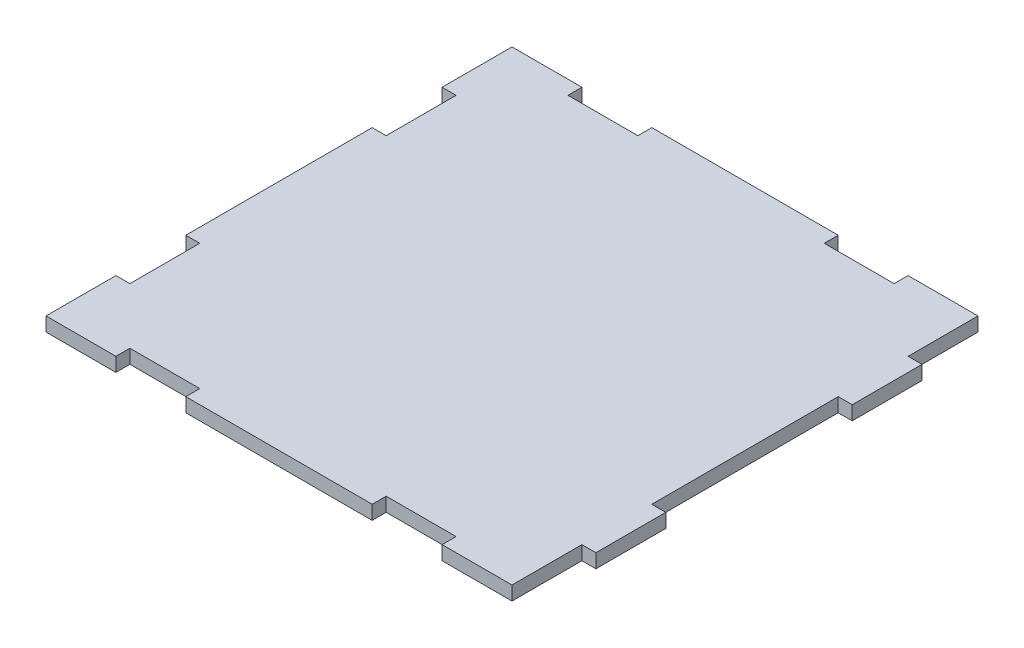
ISO-10303-21;
HEADER;
FILE_DESCRIPTION(('STEP AP214'),'2;1');
FILE_NAME('part.step','',(''),(''),'','','');
FILE_SCHEMA(('AUTOMOTIVE_DESIGN { 1 0 10303 214 1 1 1 1 }'));
ENDSEC;
DATA;
#1=APPLICATION_CONTEXT('core data for automotive mechanical design processes');
#2=APPLICATION_PROTOCOL_DEFINITION('international standard','automotive_design',2000,#1);
#3=PRODUCT_CONTEXT('',#1,'mechanical');
#4=PRODUCT('Part','Part','',(#3));
#5=PRODUCT_RELATED_PRODUCT_CATEGORY('part','',(#4));
#6=PRODUCT_DEFINITION_FORMATION('','',#4);
#7=PRODUCT_DEFINITION_CONTEXT('part definition',#1,'design');
#8=PRODUCT_DEFINITION('design','',#6,#7);
#9=PRODUCT_DEFINITION_SHAPE('','',#8);
#10=(LENGTH_UNIT() NAMED_UNIT(*) SI_UNIT(.MILLI.,.METRE.));
#11=(NAMED_UNIT(*) PLANE_ANGLE_UNIT() SI_UNIT($,.RADIAN.));
#12=(NAMED_UNIT(*) SI_UNIT($,.STERADIAN.) SOLID_ANGLE_UNIT());
#13=UNCERTAINTY_MEASURE_WITH_UNIT(LENGTH_MEASURE(1.E-05),#10,'distance_accuracy_value','');
#14=(GEOMETRIC_REPRESENTATION_CONTEXT(3) GLOBAL_UNCERTAINTY_ASSIGNED_CONTEXT((#13)) GLOBAL_UNIT_ASSIGNED_CONTEXT((#10,
#11,#12)) REPRESENTATION_CONTEXT('',''));
#15=CARTESIAN_POINT('',(0.,0.,0.));
#16=DIRECTION('',(0.,0.,1.));
#17=DIRECTION('',(1.,0.,0.));
#18=AXIS2_PLACEMENT_3D('',#15,#16,#17);
#19=CARTESIAN_POINT('',(-100.,6.,-100.));
#20=DIRECTION('',(0.,0.,1.));
#21=DIRECTION('',(1.,0.,0.));
#22=AXIS2_PLACEMENT_3D('',#19,#20,#21);
#23=PLANE('',#22);
#24=DIRECTION('',(-1.,0.,0.));
#25=VECTOR('',#24,1.);
#26=CARTESIAN_POINT('',(-100.,6.,-100.));
#27=LINE('',#26,#25);
#28=CARTESIAN_POINT('',(40.,6.,-100.));
#29=VERTEX_POINT('',#28);
#30=CARTESIAN_POINT('',(-40.,6.,-100.));
#31=VERTEX_POINT('',#30);
#32=EDGE_CURVE('E614',#29,#31,#27,.T.);
#33=ORIENTED_EDGE('',*,*,#32,.F.);
#34=DIRECTION('',(0.,1.,0.));
#35=VECTOR('',#34,1.);
#36=CARTESIAN_POINT('',(40.,-4.,-100.));
#37=LINE('',#36,#35);
#38=CARTESIAN_POINT('',(40.,0.,-100.));
#39=VERTEX_POINT('',#38);
#40=EDGE_CURVE('E473',#39,#29,#37,.T.);
#41=ORIENTED_EDGE('',*,*,#40,.F.);
#42=DIRECTION('',(-1.,0.,0.));
#43=VECTOR('',#42,1.);
#44=CARTESIAN_POINT('',(-100.,0.,-100.));
#45=LINE('',#44,#43);
#46=CARTESIAN_POINT('',(-40.,0.,-100.));
#47=VERTEX_POINT('',#46);
#48=EDGE_CURVE('E339',#39,#47,#45,.T.);
#49=ORIENTED_EDGE('',*,*,#48,.T.);
#50=DIRECTION('',(0.,1.,0.));
#51=VECTOR('',#50,1.);
#52=CARTESIAN_POINT('',(-40.,-4.,-100.));
#53=LINE('',#52,#51);
#54=EDGE_CURVE('E498',#47,#31,#53,.T.);
#55=ORIENTED_EDGE('',*,*,#54,.T.);
#56=EDGE_LOOP('',(#33,#41,#49,#55));
#57=FACE_BOUND('',#56,.T.);
#58=ADVANCED_FACE('F43',(#57),#23,.F.);
#59=CARTESIAN_POINT('',(-70.,6.,-100.));
#60=VERTEX_POINT('',#59);
#61=CARTESIAN_POINT('',(-100.,6.,-100.));
#62=VERTEX_POINT('',#61);
#63=EDGE_CURVE('E367',#60,#62,#27,.T.);
#64=ORIENTED_EDGE('',*,*,#63,.F.);
#65=DIRECTION('',(0.,1.,0.));
#66=VECTOR('',#65,1.);
#67=CARTESIAN_POINT('',(-70.,-4.,-100.));
#68=LINE('',#67,#66);
#69=CARTESIAN_POINT('',(-70.,0.,-100.));
#70=VERTEX_POINT('',#69);
#71=EDGE_CURVE('E501',#70,#60,#68,.T.);
#72=ORIENTED_EDGE('',*,*,#71,.F.);
#73=CARTESIAN_POINT('',(-100.,0.,-100.));
#74=VERTEX_POINT('',#73);
#75=EDGE_CURVE('E340',#70,#74,#45,.T.);
#76=ORIENTED_EDGE('',*,*,#75,.T.);
#77=DIRECTION('',(0.,-1.,0.));
#78=VECTOR('',#77,1.);
#79=CARTESIAN_POINT('',(-100.,6.,-100.));
#80=LINE('',#79,#78);
#81=EDGE_CURVE('E400',#62,#74,#80,.T.);
#82=ORIENTED_EDGE('',*,*,#81,.F.);
#83=EDGE_LOOP('',(#64,#72,#76,#82));
#84=FACE_BOUND('',#83,.T.);
#85=ADVANCED_FACE('F625',(#84),#23,.F.);
#86=CARTESIAN_POINT('',(-100.,6.,100.));
#87=DIRECTION('',(1.,0.,0.));
#88=DIRECTION('',(0.,0.,-1.));
#89=AXIS2_PLACEMENT_3D('',#86,#87,#88);
#90=PLANE('',#89);
#91=DIRECTION('',(0.,0.,1.));
#92=VECTOR('',#91,1.);
#93=CARTESIAN_POINT('',(-100.,0.,100.));
#94=LINE('',#93,#92);
#95=CARTESIAN_POINT('',(-100.,0.,-70.));
#96=VERTEX_POINT('',#95);
#97=EDGE_CURVE('E341',#74,#96,#94,.T.);
#98=ORIENTED_EDGE('',*,*,#97,.T.);
#99=DIRECTION('',(0.,1.,0.));
#100=VECTOR('',#99,1.);
#101=CARTESIAN_POINT('',(-100.,-4.,-70.));
#102=LINE('',#101,#100);
#103=CARTESIAN_POINT('',(-100.,6.,-70.));
#104=VERTEX_POINT('',#103);
#105=EDGE_CURVE('E460',#96,#104,#102,.T.);
#106=ORIENTED_EDGE('',*,*,#105,.T.);
#107=DIRECTION('',(0.,0.,1.));
#108=VECTOR('',#107,1.);
#109=CARTESIAN_POINT('',(-100.,6.,100.));
#110=LINE('',#109,#108);
#111=EDGE_CURVE('E303',#62,#104,#110,.T.);
#112=ORIENTED_EDGE('',*,*,#111,.F.);
#113=ORIENTED_EDGE('',*,*,#81,.T.);
#114=EDGE_LOOP('',(#98,#106,#112,#113));
#115=FACE_BOUND('',#114,.T.);
#116=ADVANCED_FACE('F624',(#115),#90,.F.);
#117=CARTESIAN_POINT('',(-100.,6.,-40.));
#118=VERTEX_POINT('',#117);
#119=CARTESIAN_POINT('',(-100.,6.,40.));
#120=VERTEX_POINT('',#119);
#121=EDGE_CURVE('E294',#118,#120,#110,.T.);
#122=ORIENTED_EDGE('',*,*,#121,.F.);
#123=DIRECTION('',(0.,1.,0.));
#124=VECTOR('',#123,1.);
#125=CARTESIAN_POINT('',(-100.,-4.,-40.));
#126=LINE('',#125,#124);
#127=CARTESIAN_POINT('',(-100.,0.,-40.));
#128=VERTEX_POINT('',#127);
#129=EDGE_CURVE('E462',#128,#118,#126,.T.);
#130=ORIENTED_EDGE('',*,*,#129,.F.);
#131=CARTESIAN_POINT('',(-100.,0.,40.));
#132=VERTEX_POINT('',#131);
#133=EDGE_CURVE('E296',#128,#132,#94,.T.);
#134=ORIENTED_EDGE('',*,*,#133,.T.);
#135=DIRECTION('',(0.,1.,0.));
#136=VECTOR('',#135,1.);
#137=CARTESIAN_POINT('',(-100.,-4.,40.));
#138=LINE('',#137,#136);
#139=EDGE_CURVE('E278',#132,#120,#138,.T.);
#140=ORIENTED_EDGE('',*,*,#139,.T.);
#141=EDGE_LOOP('',(#122,#130,#134,#140));
#142=FACE_BOUND('',#141,.T.);
#143=ADVANCED_FACE('F292',(#142),#90,.F.);
#144=CARTESIAN_POINT('',(-100.,6.,100.));
#145=DIRECTION('',(0.,0.,-1.));
#146=DIRECTION('',(-1.,0.,0.));
#147=AXIS2_PLACEMENT_3D('',#144,#145,#146);
#148=PLANE('',#147);
#149=DIRECTION('',(1.,0.,0.));
#150=VECTOR('',#149,1.);
#151=CARTESIAN_POINT('',(-100.,0.,100.));
#152=LINE('',#151,#150);
#153=CARTESIAN_POINT('',(-40.,0.,100.));
#154=VERTEX_POINT('',#153);
#155=CARTESIAN_POINT('',(40.,0.,100.));
#156=VERTEX_POINT('',#155);
#157=EDGE_CURVE('E349',#154,#156,#152,.T.);
#158=ORIENTED_EDGE('',*,*,#157,.T.);
#159=DIRECTION('',(0.,1.,0.));
#160=VECTOR('',#159,1.);
#161=CARTESIAN_POINT('',(40.,-4.,100.));
#162=LINE('',#161,#160);
#163=CARTESIAN_POINT('',(40.,6.,100.));
#164=VERTEX_POINT('',#163);
#165=EDGE_CURVE('E474',#156,#164,#162,.T.);
#166=ORIENTED_EDGE('',*,*,#165,.T.);
#167=DIRECTION('',(1.,0.,0.));
#168=VECTOR('',#167,1.);
#169=CARTESIAN_POINT('',(-100.,6.,100.));
#170=LINE('',#169,#168);
#171=CARTESIAN_POINT('',(-40.,6.,100.));
#172=VERTEX_POINT('',#171);
#173=EDGE_CURVE('E316',#172,#164,#170,.T.);
#174=ORIENTED_EDGE('',*,*,#173,.F.);
#175=DIRECTION('',(0.,1.,0.));
#176=VECTOR('',#175,1.);
#177=CARTESIAN_POINT('',(-40.,-4.,100.));
#178=LINE('',#177,#176);
#179=EDGE_CURVE('E522',#154,#172,#178,.T.);
#180=ORIENTED_EDGE('',*,*,#179,.F.);
#181=EDGE_LOOP('',(#158,#166,#174,#180));
#182=FACE_BOUND('',#181,.T.);
#183=ADVANCED_FACE('F552',(#182),#148,.F.);
#184=CARTESIAN_POINT('',(-100.,0.,100.));
#185=VERTEX_POINT('',#184);
#186=CARTESIAN_POINT('',(-70.,0.,100.));
#187=VERTEX_POINT('',#186);
#188=EDGE_CURVE('E345',#185,#187,#152,.T.);
#189=ORIENTED_EDGE('',*,*,#188,.T.);
#190=DIRECTION('',(0.,1.,0.));
#191=VECTOR('',#190,1.);
#192=CARTESIAN_POINT('',(-70.,-4.,100.));
#193=LINE('',#192,#191);
#194=CARTESIAN_POINT('',(-70.,6.,100.));
#195=VERTEX_POINT('',#194);
#196=EDGE_CURVE('E517',#187,#195,#193,.T.);
#197=ORIENTED_EDGE('',*,*,#196,.T.);
#198=CARTESIAN_POINT('',(-100.,6.,100.));
#199=VERTEX_POINT('',#198);
#200=EDGE_CURVE('E312',#199,#195,#170,.T.);
#201=ORIENTED_EDGE('',*,*,#200,.F.);
#202=DIRECTION('',(0.,-1.,0.));
#203=VECTOR('',#202,1.);
#204=CARTESIAN_POINT('',(-100.,6.,100.));
#205=LINE('',#204,#203);
#206=EDGE_CURVE('E397',#199,#185,#205,.T.);
#207=ORIENTED_EDGE('',*,*,#206,.T.);
#208=EDGE_LOOP('',(#189,#197,#201,#207));
#209=FACE_BOUND('',#208,.T.);
#210=ADVANCED_FACE('F526',(#209),#148,.F.);
#211=CARTESIAN_POINT('',(100.,0.,-100.));
#212=VERTEX_POINT('',#211);
#213=CARTESIAN_POINT('',(70.,0.,-100.));
#214=VERTEX_POINT('',#213);
#215=EDGE_CURVE('E335',#212,#214,#45,.T.);
#216=ORIENTED_EDGE('',*,*,#215,.T.);
#217=DIRECTION('',(0.,1.,0.));
#218=VECTOR('',#217,1.);
#219=CARTESIAN_POINT('',(70.,-4.,-100.));
#220=LINE('',#219,#218);
#221=CARTESIAN_POINT('',(70.,6.,-100.));
#222=VERTEX_POINT('',#221);
#223=EDGE_CURVE('E613',#214,#222,#220,.T.);
#224=ORIENTED_EDGE('',*,*,#223,.T.);
#225=CARTESIAN_POINT('',(100.,6.,-100.));
#226=VERTEX_POINT('',#225);
#227=EDGE_CURVE('E308',#226,#222,#27,.T.);
#228=ORIENTED_EDGE('',*,*,#227,.F.);
#229=DIRECTION('',(0.,-1.,0.));
#230=VECTOR('',#229,1.);
#231=CARTESIAN_POINT('',(100.,6.,-100.));
#232=LINE('',#231,#230);
#233=EDGE_CURVE('E334',#226,#212,#232,.T.);
#234=ORIENTED_EDGE('',*,*,#233,.T.);
#235=EDGE_LOOP('',(#216,#224,#228,#234));
#236=FACE_BOUND('',#235,.T.);
#237=ADVANCED_FACE('F45',(#236),#23,.F.);
#238=CARTESIAN_POINT('',(-100.,6.,70.));
#239=VERTEX_POINT('',#238);
#240=EDGE_CURVE('E304',#239,#199,#110,.T.);
#241=ORIENTED_EDGE('',*,*,#240,.F.);
#242=DIRECTION('',(0.,1.,0.));
#243=VECTOR('',#242,1.);
#244=CARTESIAN_POINT('',(-100.,-4.,70.));
#245=LINE('',#244,#243);
#246=CARTESIAN_POINT('',(-100.,0.,70.));
#247=VERTEX_POINT('',#246);
#248=EDGE_CURVE('E287',#247,#239,#245,.T.);
#249=ORIENTED_EDGE('',*,*,#248,.F.);
#250=EDGE_CURVE('E338',#247,#185,#94,.T.);
#251=ORIENTED_EDGE('',*,*,#250,.T.);
#252=ORIENTED_EDGE('',*,*,#206,.F.);
#253=EDGE_LOOP('',(#241,#249,#251,#252));
#254=FACE_BOUND('',#253,.T.);
#255=ADVANCED_FACE('F537',(#254),#90,.F.);
#256=CARTESIAN_POINT('',(70.,6.,100.));
#257=VERTEX_POINT('',#256);
#258=CARTESIAN_POINT('',(100.,6.,100.));
#259=VERTEX_POINT('',#258);
#260=EDGE_CURVE('E307',#257,#259,#170,.T.);
#261=ORIENTED_EDGE('',*,*,#260,.F.);
#262=DIRECTION('',(0.,1.,0.));
#263=VECTOR('',#262,1.);
#264=CARTESIAN_POINT('',(70.,-4.,100.));
#265=LINE('',#264,#263);
#266=CARTESIAN_POINT('',(70.,0.,100.));
#267=VERTEX_POINT('',#266);
#268=EDGE_CURVE('E478',#267,#257,#265,.T.);
#269=ORIENTED_EDGE('',*,*,#268,.F.);
#270=CARTESIAN_POINT('',(100.,0.,100.));
#271=VERTEX_POINT('',#270);
#272=EDGE_CURVE('E344',#267,#271,#152,.T.);
#273=ORIENTED_EDGE('',*,*,#272,.T.);
#274=DIRECTION('',(0.,-1.,0.));
#275=VECTOR('',#274,1.);
#276=CARTESIAN_POINT('',(100.,6.,100.));
#277=LINE('',#276,#275);
#278=EDGE_CURVE('E394',#259,#271,#277,.T.);
#279=ORIENTED_EDGE('',*,*,#278,.F.);
#280=EDGE_LOOP('',(#261,#269,#273,#279));
#281=FACE_BOUND('',#280,.T.);
#282=ADVANCED_FACE('F562',(#281),#148,.F.);
#283=CARTESIAN_POINT('',(100.,6.,70.));
#284=DIRECTION('',(-1.,0.,0.));
#285=DIRECTION('',(0.,0.,1.));
#286=AXIS2_PLACEMENT_3D('',#283,#284,#285);
#287=PLANE('',#286);
#288=DIRECTION('',(0.,0.,-1.));
#289=VECTOR('',#288,1.);
#290=CARTESIAN_POINT('',(100.,0.,70.));
#291=LINE('',#290,#289);
#292=CARTESIAN_POINT('',(100.,0.,70.));
#293=VERTEX_POINT('',#292);
#294=EDGE_CURVE('E348',#271,#293,#291,.T.);
#295=ORIENTED_EDGE('',*,*,#294,.T.);
#296=DIRECTION('',(0.,-1.,0.));
#297=VECTOR('',#296,1.);
#298=CARTESIAN_POINT('',(100.,6.,70.));
#299=LINE('',#298,#297);
#300=CARTESIAN_POINT('',(100.,6.,70.));
#301=VERTEX_POINT('',#300);
#302=EDGE_CURVE('E391',#301,#293,#299,.T.);
#303=ORIENTED_EDGE('',*,*,#302,.F.);
#304=DIRECTION('',(0.,0.,-1.));
#305=VECTOR('',#304,1.);
#306=CARTESIAN_POINT('',(100.,6.,70.));
#307=LINE('',#306,#305);
#308=EDGE_CURVE('E315',#259,#301,#307,.T.);
#309=ORIENTED_EDGE('',*,*,#308,.F.);
#310=ORIENTED_EDGE('',*,*,#278,.T.);
#311=EDGE_LOOP('',(#295,#303,#309,#310));
#312=FACE_BOUND('',#311,.T.);
#313=ADVANCED_FACE('F566',(#312),#287,.F.);
#314=CARTESIAN_POINT('',(100.,6.,70.));
#315=DIRECTION('',(0.,0.,-1.));
#316=DIRECTION('',(-1.,0.,0.));
#317=AXIS2_PLACEMENT_3D('',#314,#315,#316);
#318=PLANE('',#317);
#319=DIRECTION('',(1.,0.,0.));
#320=VECTOR('',#319,1.);
#321=CARTESIAN_POINT('',(100.,0.,70.));
#322=LINE('',#321,#320);
#323=CARTESIAN_POINT('',(106.,0.,70.));
#324=VERTEX_POINT('',#323);
#325=EDGE_CURVE('E351',#293,#324,#322,.T.);
#326=ORIENTED_EDGE('',*,*,#325,.T.);
#327=DIRECTION('',(0.,-1.,0.));
#328=VECTOR('',#327,1.);
#329=CARTESIAN_POINT('',(106.,6.,70.));
#330=LINE('',#329,#328);
#331=CARTESIAN_POINT('',(106.,6.,70.));
#332=VERTEX_POINT('',#331);
#333=EDGE_CURVE('E388',#332,#324,#330,.T.);
#334=ORIENTED_EDGE('',*,*,#333,.F.);
#335=DIRECTION('',(1.,0.,0.));
#336=VECTOR('',#335,1.);
#337=CARTESIAN_POINT('',(100.,6.,70.));
#338=LINE('',#337,#336);
#339=EDGE_CURVE('E318',#301,#332,#338,.T.);
#340=ORIENTED_EDGE('',*,*,#339,.F.);
#341=ORIENTED_EDGE('',*,*,#302,.T.);
#342=EDGE_LOOP('',(#326,#334,#340,#341));
#343=FACE_BOUND('',#342,.T.);
#344=ADVANCED_FACE('F571',(#343),#318,.F.);
#345=CARTESIAN_POINT('',(106.,6.,40.));
#346=DIRECTION('',(-1.,0.,0.));
#347=DIRECTION('',(0.,0.,1.));
#348=AXIS2_PLACEMENT_3D('',#345,#346,#347);
#349=PLANE('',#348);
#350=DIRECTION('',(0.,0.,-1.));
#351=VECTOR('',#350,1.);
#352=CARTESIAN_POINT('',(106.,0.,40.));
#353=LINE('',#352,#351);
#354=CARTESIAN_POINT('',(106.,0.,40.));
#355=VERTEX_POINT('',#354);
#356=EDGE_CURVE('E353',#324,#355,#353,.T.);
#357=ORIENTED_EDGE('',*,*,#356,.T.);
#358=DIRECTION('',(0.,-1.,0.));
#359=VECTOR('',#358,1.);
#360=CARTESIAN_POINT('',(106.,6.,40.));
#361=LINE('',#360,#359);
#362=CARTESIAN_POINT('',(106.,6.,40.));
#363=VERTEX_POINT('',#362);
#364=EDGE_CURVE('E385',#363,#355,#361,.T.);
#365=ORIENTED_EDGE('',*,*,#364,.F.);
#366=DIRECTION('',(0.,0.,-1.));
#367=VECTOR('',#366,1.);
#368=CARTESIAN_POINT('',(106.,6.,40.));
#369=LINE('',#368,#367);
#370=EDGE_CURVE('E320',#332,#363,#369,.T.);
#371=ORIENTED_EDGE('',*,*,#370,.F.);
#372=ORIENTED_EDGE('',*,*,#333,.T.);
#373=EDGE_LOOP('',(#357,#365,#371,#372));
#374=FACE_BOUND('',#373,.T.);
#375=ADVANCED_FACE('F577',(#374),#349,.F.);
#376=CARTESIAN_POINT('',(100.,6.,40.));
#377=DIRECTION('',(0.,0.,1.));
#378=DIRECTION('',(1.,0.,0.));
#379=AXIS2_PLACEMENT_3D('',#376,#377,#378);
#380=PLANE('',#379);
#381=DIRECTION('',(-1.,0.,0.));
#382=VECTOR('',#381,1.);
#383=CARTESIAN_POINT('',(100.,0.,40.));
#384=LINE('',#383,#382);
#385=CARTESIAN_POINT('',(100.,0.,40.));
#386=VERTEX_POINT('',#385);
#387=EDGE_CURVE('E355',#355,#386,#384,.T.);
#388=ORIENTED_EDGE('',*,*,#387,.T.);
#389=DIRECTION('',(0.,-1.,0.));
#390=VECTOR('',#389,1.);
#391=CARTESIAN_POINT('',(100.,6.,40.));
#392=LINE('',#391,#390);
#393=CARTESIAN_POINT('',(100.,6.,40.));
#394=VERTEX_POINT('',#393);
#395=EDGE_CURVE('E382',#394,#386,#392,.T.);
#396=ORIENTED_EDGE('',*,*,#395,.F.);
#397=DIRECTION('',(-1.,0.,0.));
#398=VECTOR('',#397,1.);
#399=CARTESIAN_POINT('',(100.,6.,40.));
#400=LINE('',#399,#398);
#401=EDGE_CURVE('E322',#363,#394,#400,.T.);
#402=ORIENTED_EDGE('',*,*,#401,.F.);
#403=ORIENTED_EDGE('',*,*,#364,.T.);
#404=EDGE_LOOP('',(#388,#396,#402,#403));
#405=FACE_BOUND('',#404,.T.);
#406=ADVANCED_FACE('F581',(#405),#380,.F.);
#407=CARTESIAN_POINT('',(100.,6.,-40.));
#408=DIRECTION('',(-1.,0.,0.));
#409=DIRECTION('',(0.,0.,1.));
#410=AXIS2_PLACEMENT_3D('',#407,#408,#409);
#411=PLANE('',#410);
#412=DIRECTION('',(0.,0.,-1.));
#413=VECTOR('',#412,1.);
#414=CARTESIAN_POINT('',(100.,0.,-40.));
#415=LINE('',#414,#413);
#416=CARTESIAN_POINT('',(100.,0.,-40.));
#417=VERTEX_POINT('',#416);
#418=EDGE_CURVE('E357',#386,#417,#415,.T.);
#419=ORIENTED_EDGE('',*,*,#418,.T.);
#420=DIRECTION('',(0.,-1.,0.));
#421=VECTOR('',#420,1.);
#422=CARTESIAN_POINT('',(100.,6.,-40.));
#423=LINE('',#422,#421);
#424=CARTESIAN_POINT('',(100.,6.,-40.));
#425=VERTEX_POINT('',#424);
#426=EDGE_CURVE('E379',#425,#417,#423,.T.);
#427=ORIENTED_EDGE('',*,*,#426,.F.);
#428=DIRECTION('',(0.,0.,-1.));
#429=VECTOR('',#428,1.);
#430=CARTESIAN_POINT('',(100.,6.,-40.));
#431=LINE('',#430,#429);
#432=EDGE_CURVE('E324',#394,#425,#431,.T.);
#433=ORIENTED_EDGE('',*,*,#432,.F.);
#434=ORIENTED_EDGE('',*,*,#395,.T.);
#435=EDGE_LOOP('',(#419,#427,#433,#434));
#436=FACE_BOUND('',#435,.T.);
#437=ADVANCED_FACE('F586',(#436),#411,.F.);
#438=CARTESIAN_POINT('',(100.,6.,-40.));
#439=DIRECTION('',(0.,0.,-1.));
#440=DIRECTION('',(-1.,0.,0.));
#441=AXIS2_PLACEMENT_3D('',#438,#439,#440);
#442=PLANE('',#441);
#443=DIRECTION('',(1.,0.,0.));
#444=VECTOR('',#443,1.);
#445=CARTESIAN_POINT('',(100.,0.,-40.));
#446=LINE('',#445,#444);
#447=CARTESIAN_POINT('',(106.,0.,-40.));
#448=VERTEX_POINT('',#447);
#449=EDGE_CURVE('E359',#417,#448,#446,.T.);
#450=ORIENTED_EDGE('',*,*,#449,.T.);
#451=DIRECTION('',(0.,-1.,0.));
#452=VECTOR('',#451,1.);
#453=CARTESIAN_POINT('',(106.,6.,-40.));
#454=LINE('',#453,#452);
#455=CARTESIAN_POINT('',(106.,6.,-40.));
#456=VERTEX_POINT('',#455);
#457=EDGE_CURVE('E376',#456,#448,#454,.T.);
#458=ORIENTED_EDGE('',*,*,#457,.F.);
#459=DIRECTION('',(1.,0.,0.));
#460=VECTOR('',#459,1.);
#461=CARTESIAN_POINT('',(100.,6.,-40.));
#462=LINE('',#461,#460);
#463=EDGE_CURVE('E326',#425,#456,#462,.T.);
#464=ORIENTED_EDGE('',*,*,#463,.F.);
#465=ORIENTED_EDGE('',*,*,#426,.T.);
#466=EDGE_LOOP('',(#450,#458,#464,#465));
#467=FACE_BOUND('',#466,.T.);
#468=ADVANCED_FACE('F592',(#467),#442,.F.);
#469=CARTESIAN_POINT('',(106.,6.,-70.));
#470=DIRECTION('',(-1.,0.,0.));
#471=DIRECTION('',(0.,0.,1.));
#472=AXIS2_PLACEMENT_3D('',#469,#470,#471);
#473=PLANE('',#472);
#474=DIRECTION('',(0.,0.,-1.));
#475=VECTOR('',#474,1.);
#476=CARTESIAN_POINT('',(106.,0.,-70.));
#477=LINE('',#476,#475);
#478=CARTESIAN_POINT('',(106.,0.,-70.));
#479=VERTEX_POINT('',#478);
#480=EDGE_CURVE('E361',#448,#479,#477,.T.);
#481=ORIENTED_EDGE('',*,*,#480,.T.);
#482=DIRECTION('',(0.,-1.,0.));
#483=VECTOR('',#482,1.);
#484=CARTESIAN_POINT('',(106.,6.,-70.));
#485=LINE('',#484,#483);
#486=CARTESIAN_POINT('',(106.,6.,-70.));
#487=VERTEX_POINT('',#486);
#488=EDGE_CURVE('E373',#487,#479,#485,.T.);
#489=ORIENTED_EDGE('',*,*,#488,.F.);
#490=DIRECTION('',(0.,0.,-1.));
#491=VECTOR('',#490,1.);
#492=CARTESIAN_POINT('',(106.,6.,-70.));
#493=LINE('',#492,#491);
#494=EDGE_CURVE('E328',#456,#487,#493,.T.);
#495=ORIENTED_EDGE('',*,*,#494,.F.);
#496=ORIENTED_EDGE('',*,*,#457,.T.);
#497=EDGE_LOOP('',(#481,#489,#495,#496));
#498=FACE_BOUND('',#497,.T.);
#499=ADVANCED_FACE('F596',(#498),#473,.F.);
#500=CARTESIAN_POINT('',(100.,6.,-70.));
#501=DIRECTION('',(0.,0.,1.));
#502=DIRECTION('',(1.,0.,0.));
#503=AXIS2_PLACEMENT_3D('',#500,#501,#502);
#504=PLANE('',#503);
#505=DIRECTION('',(-1.,0.,0.));
#506=VECTOR('',#505,1.);
#507=CARTESIAN_POINT('',(100.,0.,-70.));
#508=LINE('',#507,#506);
#509=CARTESIAN_POINT('',(100.,0.,-70.));
#510=VERTEX_POINT('',#509);
#511=EDGE_CURVE('E363',#479,#510,#508,.T.);
#512=ORIENTED_EDGE('',*,*,#511,.T.);
#513=DIRECTION('',(0.,-1.,0.));
#514=VECTOR('',#513,1.);
#515=CARTESIAN_POINT('',(100.,6.,-70.));
#516=LINE('',#515,#514);
#517=CARTESIAN_POINT('',(100.,6.,-70.));
#518=VERTEX_POINT('',#517);
#519=EDGE_CURVE('E370',#518,#510,#516,.T.);
#520=ORIENTED_EDGE('',*,*,#519,.F.);
#521=DIRECTION('',(-1.,0.,0.));
#522=VECTOR('',#521,1.);
#523=CARTESIAN_POINT('',(100.,6.,-70.));
#524=LINE('',#523,#522);
#525=EDGE_CURVE('E330',#487,#518,#524,.T.);
#526=ORIENTED_EDGE('',*,*,#525,.F.);
#527=ORIENTED_EDGE('',*,*,#488,.T.);
#528=EDGE_LOOP('',(#512,#520,#526,#527));
#529=FACE_BOUND('',#528,.T.);
#530=ADVANCED_FACE('F601',(#529),#504,.F.);
#531=CARTESIAN_POINT('',(100.,6.,-70.));
#532=DIRECTION('',(-1.,0.,0.));
#533=DIRECTION('',(0.,0.,1.));
#534=AXIS2_PLACEMENT_3D('',#531,#532,#533);
#535=PLANE('',#534);
#536=DIRECTION('',(0.,0.,-1.));
#537=VECTOR('',#536,1.);
#538=CARTESIAN_POINT('',(100.,0.,-70.));
#539=LINE('',#538,#537);
#540=EDGE_CURVE('E365',#510,#212,#539,.T.);
#541=ORIENTED_EDGE('',*,*,#540,.T.);
#542=ORIENTED_EDGE('',*,*,#233,.F.);
#543=DIRECTION('',(0.,0.,-1.));
#544=VECTOR('',#543,1.);
#545=CARTESIAN_POINT('',(100.,6.,-70.));
#546=LINE('',#545,#544);
#547=EDGE_CURVE('E332',#518,#226,#546,.T.);
#548=ORIENTED_EDGE('',*,*,#547,.F.);
#549=ORIENTED_EDGE('',*,*,#519,.T.);
#550=EDGE_LOOP('',(#541,#542,#548,#549));
#551=FACE_BOUND('',#550,.T.);
#552=ADVANCED_FACE('F608',(#551),#535,.F.);
#553=CARTESIAN_POINT('',(0.,6.,0.));
#554=DIRECTION('',(0.,1.,0.));
#555=DIRECTION('',(0.,0.,1.));
#556=AXIS2_PLACEMENT_3D('',#553,#554,#555);
#557=PLANE('',#556);
#558=DIRECTION('',(-1.,0.,0.));
#559=VECTOR('',#558,1.);
#560=CARTESIAN_POINT('',(-100.,6.,-70.));
#561=LINE('',#560,#559);
#562=CARTESIAN_POINT('',(-94.,6.,-70.));
#563=VERTEX_POINT('',#562);
#564=EDGE_CURVE('E469',#563,#104,#561,.T.);
#565=ORIENTED_EDGE('',*,*,#564,.F.);
#566=DIRECTION('',(0.,0.,-1.));
#567=VECTOR('',#566,1.);
#568=CARTESIAN_POINT('',(-94.,6.,-70.));
#569=LINE('',#568,#567);
#570=CARTESIAN_POINT('',(-94.,6.,-40.));
#571=VERTEX_POINT('',#570);
#572=EDGE_CURVE('E458',#571,#563,#569,.T.);
#573=ORIENTED_EDGE('',*,*,#572,.F.);
#574=DIRECTION('',(1.,0.,0.));
#575=VECTOR('',#574,1.);
#576=CARTESIAN_POINT('',(-100.,6.,-40.));
#577=LINE('',#576,#575);
#578=EDGE_CURVE('E302',#118,#571,#577,.T.);
#579=ORIENTED_EDGE('',*,*,#578,.F.);
#580=ORIENTED_EDGE('',*,*,#121,.T.);
#581=DIRECTION('',(-1.,0.,0.));
#582=VECTOR('',#581,1.);
#583=CARTESIAN_POINT('',(-100.,6.,40.));
#584=LINE('',#583,#582);
#585=CARTESIAN_POINT('',(-94.,6.,40.));
#586=VERTEX_POINT('',#585);
#587=EDGE_CURVE('E275',#586,#120,#584,.T.);
#588=ORIENTED_EDGE('',*,*,#587,.F.);
#589=DIRECTION('',(0.,0.,-1.));
#590=VECTOR('',#589,1.);
#591=CARTESIAN_POINT('',(-94.,6.,40.));
#592=LINE('',#591,#590);
#593=CARTESIAN_POINT('',(-94.,6.,70.));
#594=VERTEX_POINT('',#593);
#595=EDGE_CURVE('E286',#594,#586,#592,.T.);
#596=ORIENTED_EDGE('',*,*,#595,.F.);
#597=DIRECTION('',(1.,0.,0.));
#598=VECTOR('',#597,1.);
#599=CARTESIAN_POINT('',(-100.,6.,70.));
#600=LINE('',#599,#598);
#601=EDGE_CURVE('E465',#239,#594,#600,.T.);
#602=ORIENTED_EDGE('',*,*,#601,.F.);
#603=ORIENTED_EDGE('',*,*,#240,.T.);
#604=ORIENTED_EDGE('',*,*,#200,.T.);
#605=DIRECTION('',(0.,0.,1.));
#606=VECTOR('',#605,1.);
#607=CARTESIAN_POINT('',(-70.,6.,100.));
#608=LINE('',#607,#606);
#609=CARTESIAN_POINT('',(-70.,6.,94.));
#610=VERTEX_POINT('',#609);
#611=EDGE_CURVE('E492',#610,#195,#608,.T.);
#612=ORIENTED_EDGE('',*,*,#611,.F.);
#613=DIRECTION('',(-1.,0.,0.));
#614=VECTOR('',#613,1.);
#615=CARTESIAN_POINT('',(-70.,6.,94.));
#616=LINE('',#615,#614);
#617=CARTESIAN_POINT('',(-40.,6.,94.));
#618=VERTEX_POINT('',#617);
#619=EDGE_CURVE('E514',#618,#610,#616,.T.);
#620=ORIENTED_EDGE('',*,*,#619,.F.);
#621=DIRECTION('',(0.,0.,-1.));
#622=VECTOR('',#621,1.);
#623=CARTESIAN_POINT('',(-40.,6.,100.));
#624=LINE('',#623,#622);
#625=EDGE_CURVE('E511',#172,#618,#624,.T.);
#626=ORIENTED_EDGE('',*,*,#625,.F.);
#627=ORIENTED_EDGE('',*,*,#173,.T.);
#628=DIRECTION('',(0.,0.,1.));
#629=VECTOR('',#628,1.);
#630=CARTESIAN_POINT('',(40.,6.,100.));
#631=LINE('',#630,#629);
#632=CARTESIAN_POINT('',(40.,6.,94.));
#633=VERTEX_POINT('',#632);
#634=EDGE_CURVE('E490',#633,#164,#631,.T.);
#635=ORIENTED_EDGE('',*,*,#634,.F.);
#636=DIRECTION('',(-1.,0.,0.));
#637=VECTOR('',#636,1.);
#638=CARTESIAN_POINT('',(40.,6.,94.));
#639=LINE('',#638,#637);
#640=CARTESIAN_POINT('',(70.,6.,94.));
#641=VERTEX_POINT('',#640);
#642=EDGE_CURVE('E477',#641,#633,#639,.T.);
#643=ORIENTED_EDGE('',*,*,#642,.F.);
#644=DIRECTION('',(0.,0.,-1.));
#645=VECTOR('',#644,1.);
#646=CARTESIAN_POINT('',(70.,6.,100.));
#647=LINE('',#646,#645);
#648=EDGE_CURVE('E487',#257,#641,#647,.T.);
#649=ORIENTED_EDGE('',*,*,#648,.F.);
#650=ORIENTED_EDGE('',*,*,#260,.T.);
#651=ORIENTED_EDGE('',*,*,#308,.T.);
#652=ORIENTED_EDGE('',*,*,#339,.T.);
#653=ORIENTED_EDGE('',*,*,#370,.T.);
#654=ORIENTED_EDGE('',*,*,#401,.T.);
#655=ORIENTED_EDGE('',*,*,#432,.T.);
#656=ORIENTED_EDGE('',*,*,#463,.T.);
#657=ORIENTED_EDGE('',*,*,#494,.T.);
#658=ORIENTED_EDGE('',*,*,#525,.T.);
#659=ORIENTED_EDGE('',*,*,#547,.T.);
#660=ORIENTED_EDGE('',*,*,#227,.T.);
#661=DIRECTION('',(0.,0.,-1.));
#662=VECTOR('',#661,1.);
#663=CARTESIAN_POINT('',(70.,6.,-100.));
#664=LINE('',#663,#662);
#665=CARTESIAN_POINT('',(70.,6.,-94.));
#666=VERTEX_POINT('',#665);
#667=EDGE_CURVE('E643',#666,#222,#664,.T.);
#668=ORIENTED_EDGE('',*,*,#667,.F.);
#669=DIRECTION('',(1.,0.,0.));
#670=VECTOR('',#669,1.);
#671=CARTESIAN_POINT('',(40.,6.,-94.));
#672=LINE('',#671,#670);
#673=CARTESIAN_POINT('',(40.,6.,-94.));
#674=VERTEX_POINT('',#673);
#675=EDGE_CURVE('E639',#674,#666,#672,.T.);
#676=ORIENTED_EDGE('',*,*,#675,.F.);
#677=DIRECTION('',(0.,0.,1.));
#678=VECTOR('',#677,1.);
#679=CARTESIAN_POINT('',(40.,6.,-100.));
#680=LINE('',#679,#678);
#681=EDGE_CURVE('E503',#29,#674,#680,.T.);
#682=ORIENTED_EDGE('',*,*,#681,.F.);
#683=ORIENTED_EDGE('',*,*,#32,.T.);
#684=DIRECTION('',(0.,0.,-1.));
#685=VECTOR('',#684,1.);
#686=CARTESIAN_POINT('',(-40.,6.,-100.));
#687=LINE('',#686,#685);
#688=CARTESIAN_POINT('',(-40.,6.,-94.));
#689=VERTEX_POINT('',#688);
#690=EDGE_CURVE('E495',#689,#31,#687,.T.);
#691=ORIENTED_EDGE('',*,*,#690,.F.);
#692=DIRECTION('',(1.,0.,0.));
#693=VECTOR('',#692,1.);
#694=CARTESIAN_POINT('',(-70.,6.,-94.));
#695=LINE('',#694,#693);
#696=CARTESIAN_POINT('',(-70.,6.,-94.));
#697=VERTEX_POINT('',#696);
#698=EDGE_CURVE('E505',#697,#689,#695,.T.);
#699=ORIENTED_EDGE('',*,*,#698,.F.);
#700=DIRECTION('',(0.,0.,1.));
#701=VECTOR('',#700,1.);
#702=CARTESIAN_POINT('',(-70.,6.,-100.));
#703=LINE('',#702,#701);
#704=EDGE_CURVE('E484',#60,#697,#703,.T.);
#705=ORIENTED_EDGE('',*,*,#704,.F.);
#706=ORIENTED_EDGE('',*,*,#63,.T.);
#707=ORIENTED_EDGE('',*,*,#111,.T.);
#708=EDGE_LOOP('',(#565,#573,#579,#580,#588,#596,#602,#603,#604,#612,#620,#626,#627,#635,#643,
#649,#650,#651,#652,#653,#654,#655,#656,#657,#658,#659,#660,#668,#676,#682,#683,#691,#699,#705,
#706,#707));
#709=FACE_BOUND('',#708,.T.);
#710=ADVANCED_FACE('F300',(#709),#557,.T.);
#711=CARTESIAN_POINT('',(0.,0.,0.));
#712=DIRECTION('',(0.,1.,0.));
#713=DIRECTION('',(0.,0.,1.));
#714=AXIS2_PLACEMENT_3D('',#711,#712,#713);
#715=PLANE('',#714);
#716=DIRECTION('',(0.,0.,-1.));
#717=VECTOR('',#716,1.);
#718=CARTESIAN_POINT('',(-94.,0.,0.));
#719=LINE('',#718,#717);
#720=CARTESIAN_POINT('',(-94.,0.,-40.));
#721=VERTEX_POINT('',#720);
#722=CARTESIAN_POINT('',(-94.,0.,-70.));
#723=VERTEX_POINT('',#722);
#724=EDGE_CURVE('E51',#721,#723,#719,.T.);
#725=ORIENTED_EDGE('',*,*,#724,.T.);
#726=DIRECTION('',(-1.,0.,0.));
#727=VECTOR('',#726,1.);
#728=CARTESIAN_POINT('',(0.,0.,-70.));
#729=LINE('',#728,#727);
#730=EDGE_CURVE('E11',#723,#96,#729,.T.);
#731=ORIENTED_EDGE('',*,*,#730,.T.);
#732=ORIENTED_EDGE('',*,*,#97,.F.);
#733=ORIENTED_EDGE('',*,*,#75,.F.);
#734=DIRECTION('',(0.,0.,1.));
#735=VECTOR('',#734,1.);
#736=CARTESIAN_POINT('',(-70.,0.,0.));
#737=LINE('',#736,#735);
#738=CARTESIAN_POINT('',(-70.,0.,-94.));
#739=VERTEX_POINT('',#738);
#740=EDGE_CURVE('E435',#70,#739,#737,.T.);
#741=ORIENTED_EDGE('',*,*,#740,.T.);
#742=DIRECTION('',(1.,0.,0.));
#743=VECTOR('',#742,1.);
#744=CARTESIAN_POINT('',(0.,0.,-94.));
#745=LINE('',#744,#743);
#746=CARTESIAN_POINT('',(-40.,0.,-94.));
#747=VERTEX_POINT('',#746);
#748=EDGE_CURVE('E429',#739,#747,#745,.T.);
#749=ORIENTED_EDGE('',*,*,#748,.T.);
#750=DIRECTION('',(0.,0.,-1.));
#751=VECTOR('',#750,1.);
#752=CARTESIAN_POINT('',(-40.,0.,0.));
#753=LINE('',#752,#751);
#754=EDGE_CURVE('E432',#747,#47,#753,.T.);
#755=ORIENTED_EDGE('',*,*,#754,.T.);
#756=ORIENTED_EDGE('',*,*,#48,.F.);
#757=DIRECTION('',(0.,0.,1.));
#758=VECTOR('',#757,1.);
#759=CARTESIAN_POINT('',(40.,0.,0.));
#760=LINE('',#759,#758);
#761=CARTESIAN_POINT('',(40.,0.,-94.));
#762=VERTEX_POINT('',#761);
#763=EDGE_CURVE('E444',#39,#762,#760,.T.);
#764=ORIENTED_EDGE('',*,*,#763,.T.);
#765=DIRECTION('',(1.,0.,0.));
#766=VECTOR('',#765,1.);
#767=CARTESIAN_POINT('',(0.,0.,-94.));
#768=LINE('',#767,#766);
#769=CARTESIAN_POINT('',(70.,0.,-94.));
#770=VERTEX_POINT('',#769);
#771=EDGE_CURVE('E438',#762,#770,#768,.T.);
#772=ORIENTED_EDGE('',*,*,#771,.T.);
#773=DIRECTION('',(0.,0.,-1.));
#774=VECTOR('',#773,1.);
#775=CARTESIAN_POINT('',(70.,0.,0.));
#776=LINE('',#775,#774);
#777=EDGE_CURVE('E441',#770,#214,#776,.T.);
#778=ORIENTED_EDGE('',*,*,#777,.T.);
#779=ORIENTED_EDGE('',*,*,#215,.F.);
#780=ORIENTED_EDGE('',*,*,#540,.F.);
#781=ORIENTED_EDGE('',*,*,#511,.F.);
#782=ORIENTED_EDGE('',*,*,#480,.F.);
#783=ORIENTED_EDGE('',*,*,#449,.F.);
#784=ORIENTED_EDGE('',*,*,#418,.F.);
#785=ORIENTED_EDGE('',*,*,#387,.F.);
#786=ORIENTED_EDGE('',*,*,#356,.F.);
#787=ORIENTED_EDGE('',*,*,#325,.F.);
#788=ORIENTED_EDGE('',*,*,#294,.F.);
#789=ORIENTED_EDGE('',*,*,#272,.F.);
#790=DIRECTION('',(0.,0.,-1.));
#791=VECTOR('',#790,1.);
#792=CARTESIAN_POINT('',(70.,0.,0.));
#793=LINE('',#792,#791);
#794=CARTESIAN_POINT('',(70.,0.,94.));
#795=VERTEX_POINT('',#794);
#796=EDGE_CURVE('E420',#267,#795,#793,.T.);
#797=ORIENTED_EDGE('',*,*,#796,.T.);
#798=DIRECTION('',(-1.,0.,0.));
#799=VECTOR('',#798,1.);
#800=CARTESIAN_POINT('',(0.,0.,94.));
#801=LINE('',#800,#799);
#802=CARTESIAN_POINT('',(40.,0.,94.));
#803=VERTEX_POINT('',#802);
#804=EDGE_CURVE('E423',#795,#803,#801,.T.);
#805=ORIENTED_EDGE('',*,*,#804,.T.);
#806=DIRECTION('',(0.,0.,1.));
#807=VECTOR('',#806,1.);
#808=CARTESIAN_POINT('',(40.,0.,0.));
#809=LINE('',#808,#807);
#810=EDGE_CURVE('E426',#803,#156,#809,.T.);
#811=ORIENTED_EDGE('',*,*,#810,.T.);
#812=ORIENTED_EDGE('',*,*,#157,.F.);
#813=DIRECTION('',(0.,0.,-1.));
#814=VECTOR('',#813,1.);
#815=CARTESIAN_POINT('',(-40.,0.,0.));
#816=LINE('',#815,#814);
#817=CARTESIAN_POINT('',(-40.,0.,94.));
#818=VERTEX_POINT('',#817);
#819=EDGE_CURVE('E403',#154,#818,#816,.T.);
#820=ORIENTED_EDGE('',*,*,#819,.T.);
#821=DIRECTION('',(-1.,0.,0.));
#822=VECTOR('',#821,1.);
#823=CARTESIAN_POINT('',(0.,0.,94.));
#824=LINE('',#823,#822);
#825=CARTESIAN_POINT('',(-70.,0.,94.));
#826=VERTEX_POINT('',#825);
#827=EDGE_CURVE('E406',#818,#826,#824,.T.);
#828=ORIENTED_EDGE('',*,*,#827,.T.);
#829=DIRECTION('',(0.,0.,1.));
#830=VECTOR('',#829,1.);
#831=CARTESIAN_POINT('',(-70.,0.,0.));
#832=LINE('',#831,#830);
#833=EDGE_CURVE('E409',#826,#187,#832,.T.);
#834=ORIENTED_EDGE('',*,*,#833,.T.);
#835=ORIENTED_EDGE('',*,*,#188,.F.);
#836=ORIENTED_EDGE('',*,*,#250,.F.);
#837=DIRECTION('',(1.,0.,0.));
#838=VECTOR('',#837,1.);
#839=CARTESIAN_POINT('',(0.,0.,70.));
#840=LINE('',#839,#838);
#841=CARTESIAN_POINT('',(-94.,0.,70.));
#842=VERTEX_POINT('',#841);
#843=EDGE_CURVE('E412',#247,#842,#840,.T.);
#844=ORIENTED_EDGE('',*,*,#843,.T.);
#845=DIRECTION('',(0.,0.,-1.));
#846=VECTOR('',#845,1.);
#847=CARTESIAN_POINT('',(-94.,0.,0.));
#848=LINE('',#847,#846);
#849=CARTESIAN_POINT('',(-94.,0.,40.));
#850=VERTEX_POINT('',#849);
#851=EDGE_CURVE('E415',#842,#850,#848,.T.);
#852=ORIENTED_EDGE('',*,*,#851,.T.);
#853=DIRECTION('',(-1.,0.,0.));
#854=VECTOR('',#853,1.);
#855=CARTESIAN_POINT('',(0.,0.,40.));
#856=LINE('',#855,#854);
#857=EDGE_CURVE('E418',#850,#132,#856,.T.);
#858=ORIENTED_EDGE('',*,*,#857,.T.);
#859=ORIENTED_EDGE('',*,*,#133,.F.);
#860=DIRECTION('',(1.,0.,0.));
#861=VECTOR('',#860,1.);
#862=CARTESIAN_POINT('',(0.,0.,-40.));
#863=LINE('',#862,#861);
#864=EDGE_CURVE('E447',#128,#721,#863,.T.);
#865=ORIENTED_EDGE('',*,*,#864,.T.);
#866=EDGE_LOOP('',(#725,#731,#732,#733,#741,#749,#755,#756,#764,#772,#778,#779,#780,#781,#782,
#783,#784,#785,#786,#787,#788,#789,#797,#805,#811,#812,#820,#828,#834,#835,#836,#844,#852,#858,
#859,#865));
#867=FACE_BOUND('',#866,.T.);
#868=ADVANCED_FACE('F451',(#867),#715,.F.);
#869=CARTESIAN_POINT('',(-70.,-4.,100.));
#870=DIRECTION('',(-1.,0.,0.));
#871=DIRECTION('',(0.,0.,1.));
#872=AXIS2_PLACEMENT_3D('',#869,#870,#871);
#873=PLANE('',#872);
#874=DIRECTION('',(0.,1.,0.));
#875=VECTOR('',#874,1.);
#876=CARTESIAN_POINT('',(-70.,-4.,94.));
#877=LINE('',#876,#875);
#878=EDGE_CURVE('E518',#826,#610,#877,.T.);
#879=ORIENTED_EDGE('',*,*,#878,.T.);
#880=ORIENTED_EDGE('',*,*,#611,.T.);
#881=ORIENTED_EDGE('',*,*,#196,.F.);
#882=ORIENTED_EDGE('',*,*,#833,.F.);
#883=EDGE_LOOP('',(#879,#880,#881,#882));
#884=FACE_BOUND('',#883,.T.);
#885=ADVANCED_FACE('F541',(#884),#873,.F.);
#886=CARTESIAN_POINT('',(-70.,-4.,94.));
#887=DIRECTION('',(0.,0.,-1.));
#888=DIRECTION('',(-1.,0.,0.));
#889=AXIS2_PLACEMENT_3D('',#886,#887,#888);
#890=PLANE('',#889);
#891=DIRECTION('',(0.,1.,0.));
#892=VECTOR('',#891,1.);
#893=CARTESIAN_POINT('',(-40.,-4.,94.));
#894=LINE('',#893,#892);
#895=EDGE_CURVE('E520',#818,#618,#894,.T.);
#896=ORIENTED_EDGE('',*,*,#895,.T.);
#897=ORIENTED_EDGE('',*,*,#619,.T.);
#898=ORIENTED_EDGE('',*,*,#878,.F.);
#899=ORIENTED_EDGE('',*,*,#827,.F.);
#900=EDGE_LOOP('',(#896,#897,#898,#899));
#901=FACE_BOUND('',#900,.T.);
#902=ADVANCED_FACE('F543',(#901),#890,.F.);
#903=CARTESIAN_POINT('',(-40.,-4.,100.));
#904=DIRECTION('',(1.,0.,0.));
#905=DIRECTION('',(0.,0.,-1.));
#906=AXIS2_PLACEMENT_3D('',#903,#904,#905);
#907=PLANE('',#906);
#908=ORIENTED_EDGE('',*,*,#179,.T.);
#909=ORIENTED_EDGE('',*,*,#625,.T.);
#910=ORIENTED_EDGE('',*,*,#895,.F.);
#911=ORIENTED_EDGE('',*,*,#819,.F.);
#912=EDGE_LOOP('',(#908,#909,#910,#911));
#913=FACE_BOUND('',#912,.T.);
#914=ADVANCED_FACE('F720',(#913),#907,.F.);
#915=CARTESIAN_POINT('',(-100.,-4.,40.));
#916=DIRECTION('',(0.,0.,-1.));
#917=DIRECTION('',(-1.,0.,0.));
#918=AXIS2_PLACEMENT_3D('',#915,#916,#917);
#919=PLANE('',#918);
#920=DIRECTION('',(0.,1.,0.));
#921=VECTOR('',#920,1.);
#922=CARTESIAN_POINT('',(-94.,-4.,40.));
#923=LINE('',#922,#921);
#924=EDGE_CURVE('E281',#850,#586,#923,.T.);
#925=ORIENTED_EDGE('',*,*,#924,.T.);
#926=ORIENTED_EDGE('',*,*,#587,.T.);
#927=ORIENTED_EDGE('',*,*,#139,.F.);
#928=ORIENTED_EDGE('',*,*,#857,.F.);
#929=EDGE_LOOP('',(#925,#926,#927,#928));
#930=FACE_BOUND('',#929,.T.);
#931=ADVANCED_FACE('F277',(#930),#919,.F.);
#932=CARTESIAN_POINT('',(-94.,-4.,40.));
#933=DIRECTION('',(1.,0.,0.));
#934=DIRECTION('',(0.,0.,-1.));
#935=AXIS2_PLACEMENT_3D('',#932,#933,#934);
#936=PLANE('',#935);
#937=DIRECTION('',(0.,1.,0.));
#938=VECTOR('',#937,1.);
#939=CARTESIAN_POINT('',(-94.,-4.,70.));
#940=LINE('',#939,#938);
#941=EDGE_CURVE('E650',#842,#594,#940,.T.);
#942=ORIENTED_EDGE('',*,*,#941,.T.);
#943=ORIENTED_EDGE('',*,*,#595,.T.);
#944=ORIENTED_EDGE('',*,*,#924,.F.);
#945=ORIENTED_EDGE('',*,*,#851,.F.);
#946=EDGE_LOOP('',(#942,#943,#944,#945));
#947=FACE_BOUND('',#946,.T.);
#948=ADVANCED_FACE('F649',(#947),#936,.F.);
#949=CARTESIAN_POINT('',(-100.,-4.,70.));
#950=DIRECTION('',(0.,0.,1.));
#951=DIRECTION('',(1.,0.,0.));
#952=AXIS2_PLACEMENT_3D('',#949,#950,#951);
#953=PLANE('',#952);
#954=ORIENTED_EDGE('',*,*,#248,.T.);
#955=ORIENTED_EDGE('',*,*,#601,.T.);
#956=ORIENTED_EDGE('',*,*,#941,.F.);
#957=ORIENTED_EDGE('',*,*,#843,.F.);
#958=EDGE_LOOP('',(#954,#955,#956,#957));
#959=FACE_BOUND('',#958,.T.);
#960=ADVANCED_FACE('F742',(#959),#953,.F.);
#961=CARTESIAN_POINT('',(40.,-4.,100.));
#962=DIRECTION('',(-1.,0.,0.));
#963=DIRECTION('',(0.,0.,1.));
#964=AXIS2_PLACEMENT_3D('',#961,#962,#963);
#965=PLANE('',#964);
#966=DIRECTION('',(0.,1.,0.));
#967=VECTOR('',#966,1.);
#968=CARTESIAN_POINT('',(40.,-4.,94.));
#969=LINE('',#968,#967);
#970=EDGE_CURVE('E482',#803,#633,#969,.T.);
#971=ORIENTED_EDGE('',*,*,#970,.T.);
#972=ORIENTED_EDGE('',*,*,#634,.T.);
#973=ORIENTED_EDGE('',*,*,#165,.F.);
#974=ORIENTED_EDGE('',*,*,#810,.F.);
#975=EDGE_LOOP('',(#971,#972,#973,#974));
#976=FACE_BOUND('',#975,.T.);
#977=ADVANCED_FACE('F735',(#976),#965,.F.);
#978=CARTESIAN_POINT('',(40.,-4.,94.));
#979=DIRECTION('',(0.,0.,-1.));
#980=DIRECTION('',(-1.,0.,0.));
#981=AXIS2_PLACEMENT_3D('',#978,#979,#980);
#982=PLANE('',#981);
#983=DIRECTION('',(0.,1.,0.));
#984=VECTOR('',#983,1.);
#985=CARTESIAN_POINT('',(70.,-4.,94.));
#986=LINE('',#985,#984);
#987=EDGE_CURVE('E480',#795,#641,#986,.T.);
#988=ORIENTED_EDGE('',*,*,#987,.T.);
#989=ORIENTED_EDGE('',*,*,#642,.T.);
#990=ORIENTED_EDGE('',*,*,#970,.F.);
#991=ORIENTED_EDGE('',*,*,#804,.F.);
#992=EDGE_LOOP('',(#988,#989,#990,#991));
#993=FACE_BOUND('',#992,.T.);
#994=ADVANCED_FACE('F732',(#993),#982,.F.);
#995=CARTESIAN_POINT('',(70.,-4.,100.));
#996=DIRECTION('',(1.,0.,0.));
#997=DIRECTION('',(0.,0.,-1.));
#998=AXIS2_PLACEMENT_3D('',#995,#996,#997);
#999=PLANE('',#998);
#1000=ORIENTED_EDGE('',*,*,#268,.T.);
#1001=ORIENTED_EDGE('',*,*,#648,.T.);
#1002=ORIENTED_EDGE('',*,*,#987,.F.);
#1003=ORIENTED_EDGE('',*,*,#796,.F.);
#1004=EDGE_LOOP('',(#1000,#1001,#1002,#1003));
#1005=FACE_BOUND('',#1004,.T.);
#1006=ADVANCED_FACE('F730',(#1005),#999,.F.);
#1007=CARTESIAN_POINT('',(-70.,-4.,-100.));
#1008=DIRECTION('',(-1.,0.,0.));
#1009=DIRECTION('',(0.,0.,1.));
#1010=AXIS2_PLACEMENT_3D('',#1007,#1008,#1009);
#1011=PLANE('',#1010);
#1012=ORIENTED_EDGE('',*,*,#71,.T.);
#1013=ORIENTED_EDGE('',*,*,#704,.T.);
#1014=DIRECTION('',(0.,1.,0.));
#1015=VECTOR('',#1014,1.);
#1016=CARTESIAN_POINT('',(-70.,-4.,-94.));
#1017=LINE('',#1016,#1015);
#1018=EDGE_CURVE('E493',#739,#697,#1017,.T.);
#1019=ORIENTED_EDGE('',*,*,#1018,.F.);
#1020=ORIENTED_EDGE('',*,*,#740,.F.);
#1021=EDGE_LOOP('',(#1012,#1013,#1019,#1020));
#1022=FACE_BOUND('',#1021,.T.);
#1023=ADVANCED_FACE('F726',(#1022),#1011,.F.);
#1024=CARTESIAN_POINT('',(-40.,-4.,-100.));
#1025=DIRECTION('',(1.,0.,0.));
#1026=DIRECTION('',(0.,0.,-1.));
#1027=AXIS2_PLACEMENT_3D('',#1024,#1025,#1026);
#1028=PLANE('',#1027);
#1029=DIRECTION('',(0.,1.,0.));
#1030=VECTOR('',#1029,1.);
#1031=CARTESIAN_POINT('',(-40.,-4.,-94.));
#1032=LINE('',#1031,#1030);
#1033=EDGE_CURVE('E496',#747,#689,#1032,.T.);
#1034=ORIENTED_EDGE('',*,*,#1033,.T.);
#1035=ORIENTED_EDGE('',*,*,#690,.T.);
#1036=ORIENTED_EDGE('',*,*,#54,.F.);
#1037=ORIENTED_EDGE('',*,*,#754,.F.);
#1038=EDGE_LOOP('',(#1034,#1035,#1036,#1037));
#1039=FACE_BOUND('',#1038,.T.);
#1040=ADVANCED_FACE('F634',(#1039),#1028,.F.);
#1041=CARTESIAN_POINT('',(-70.,-4.,-94.));
#1042=DIRECTION('',(0.,0.,1.));
#1043=DIRECTION('',(1.,0.,0.));
#1044=AXIS2_PLACEMENT_3D('',#1041,#1042,#1043);
#1045=PLANE('',#1044);
#1046=ORIENTED_EDGE('',*,*,#1018,.T.);
#1047=ORIENTED_EDGE('',*,*,#698,.T.);
#1048=ORIENTED_EDGE('',*,*,#1033,.F.);
#1049=ORIENTED_EDGE('',*,*,#748,.F.);
#1050=EDGE_LOOP('',(#1046,#1047,#1048,#1049));
#1051=FACE_BOUND('',#1050,.T.);
#1052=ADVANCED_FACE('F666',(#1051),#1045,.F.);
#1053=CARTESIAN_POINT('',(40.,-4.,-100.));
#1054=DIRECTION('',(-1.,0.,0.));
#1055=DIRECTION('',(0.,0.,1.));
#1056=AXIS2_PLACEMENT_3D('',#1053,#1054,#1055);
#1057=PLANE('',#1056);
#1058=ORIENTED_EDGE('',*,*,#40,.T.);
#1059=ORIENTED_EDGE('',*,*,#681,.T.);
#1060=DIRECTION('',(0.,1.,0.));
#1061=VECTOR('',#1060,1.);
#1062=CARTESIAN_POINT('',(40.,-4.,-94.));
#1063=LINE('',#1062,#1061);
#1064=EDGE_CURVE('E657',#762,#674,#1063,.T.);
#1065=ORIENTED_EDGE('',*,*,#1064,.F.);
#1066=ORIENTED_EDGE('',*,*,#763,.F.);
#1067=EDGE_LOOP('',(#1058,#1059,#1065,#1066));
#1068=FACE_BOUND('',#1067,.T.);
#1069=ADVANCED_FACE('F664',(#1068),#1057,.F.);
#1070=CARTESIAN_POINT('',(70.,-4.,-100.));
#1071=DIRECTION('',(1.,0.,0.));
#1072=DIRECTION('',(0.,0.,-1.));
#1073=AXIS2_PLACEMENT_3D('',#1070,#1071,#1072);
#1074=PLANE('',#1073);
#1075=DIRECTION('',(0.,1.,0.));
#1076=VECTOR('',#1075,1.);
#1077=CARTESIAN_POINT('',(70.,-4.,-94.));
#1078=LINE('',#1077,#1076);
#1079=EDGE_CURVE('E66',#770,#666,#1078,.T.);
#1080=ORIENTED_EDGE('',*,*,#1079,.T.);
#1081=ORIENTED_EDGE('',*,*,#667,.T.);
#1082=ORIENTED_EDGE('',*,*,#223,.F.);
#1083=ORIENTED_EDGE('',*,*,#777,.F.);
#1084=EDGE_LOOP('',(#1080,#1081,#1082,#1083));
#1085=FACE_BOUND('',#1084,.T.);
#1086=ADVANCED_FACE('F662',(#1085),#1074,.F.);
#1087=CARTESIAN_POINT('',(40.,-4.,-94.));
#1088=DIRECTION('',(0.,0.,1.));
#1089=DIRECTION('',(1.,0.,0.));
#1090=AXIS2_PLACEMENT_3D('',#1087,#1088,#1089);
#1091=PLANE('',#1090);
#1092=ORIENTED_EDGE('',*,*,#1064,.T.);
#1093=ORIENTED_EDGE('',*,*,#675,.T.);
#1094=ORIENTED_EDGE('',*,*,#1079,.F.);
#1095=ORIENTED_EDGE('',*,*,#771,.F.);
#1096=EDGE_LOOP('',(#1092,#1093,#1094,#1095));
#1097=FACE_BOUND('',#1096,.T.);
#1098=ADVANCED_FACE('F663',(#1097),#1091,.F.);
#1099=CARTESIAN_POINT('',(-100.,-4.,-70.));
#1100=DIRECTION('',(0.,0.,-1.));
#1101=DIRECTION('',(-1.,0.,0.));
#1102=AXIS2_PLACEMENT_3D('',#1099,#1100,#1101);
#1103=PLANE('',#1102);
#1104=DIRECTION('',(0.,1.,0.));
#1105=VECTOR('',#1104,1.);
#1106=CARTESIAN_POINT('',(-94.,-4.,-70.));
#1107=LINE('',#1106,#1105);
#1108=EDGE_CURVE('E457',#723,#563,#1107,.T.);
#1109=ORIENTED_EDGE('',*,*,#1108,.T.);
#1110=ORIENTED_EDGE('',*,*,#564,.T.);
#1111=ORIENTED_EDGE('',*,*,#105,.F.);
#1112=ORIENTED_EDGE('',*,*,#730,.F.);
#1113=EDGE_LOOP('',(#1109,#1110,#1111,#1112));
#1114=FACE_BOUND('',#1113,.T.);
#1115=ADVANCED_FACE('F744',(#1114),#1103,.F.);
#1116=CARTESIAN_POINT('',(-94.,-4.,-70.));
#1117=DIRECTION('',(1.,0.,0.));
#1118=DIRECTION('',(0.,0.,-1.));
#1119=AXIS2_PLACEMENT_3D('',#1116,#1117,#1118);
#1120=PLANE('',#1119);
#1121=DIRECTION('',(0.,1.,0.));
#1122=VECTOR('',#1121,1.);
#1123=CARTESIAN_POINT('',(-94.,-4.,-40.));
#1124=LINE('',#1123,#1122);
#1125=EDGE_CURVE('E58',#721,#571,#1124,.T.);
#1126=ORIENTED_EDGE('',*,*,#1125,.T.);
#1127=ORIENTED_EDGE('',*,*,#572,.T.);
#1128=ORIENTED_EDGE('',*,*,#1108,.F.);
#1129=ORIENTED_EDGE('',*,*,#724,.F.);
#1130=EDGE_LOOP('',(#1126,#1127,#1128,#1129));
#1131=FACE_BOUND('',#1130,.T.);
#1132=ADVANCED_FACE('F455',(#1131),#1120,.F.);
#1133=CARTESIAN_POINT('',(-100.,-4.,-40.));
#1134=DIRECTION('',(0.,0.,1.));
#1135=DIRECTION('',(1.,0.,0.));
#1136=AXIS2_PLACEMENT_3D('',#1133,#1134,#1135);
#1137=PLANE('',#1136);
#1138=ORIENTED_EDGE('',*,*,#129,.T.);
#1139=ORIENTED_EDGE('',*,*,#578,.T.);
#1140=ORIENTED_EDGE('',*,*,#1125,.F.);
#1141=ORIENTED_EDGE('',*,*,#864,.F.);
#1142=EDGE_LOOP('',(#1138,#1139,#1140,#1141));
#1143=FACE_BOUND('',#1142,.T.);
#1144=ADVANCED_FACE('F646',(#1143),#1137,.F.);
#1145=CLOSED_SHELL('',(#58,#85,#116,#143,#183,#210,#237,#255,#282,#313,#344,#375,#406,#437,#468,
#499,#530,#552,#710,#868,#885,#902,#914,#931,#948,#960,#977,#994,#1006,#1023,#1040,#1052,#1069,
#1086,#1098,#1115,#1132,#1144));
#1146=MANIFOLD_SOLID_BREP('B2',#1145);
#1147=ADVANCED_BREP_SHAPE_REPRESENTATION('',(#18,#1146),#14);
#1148=SHAPE_DEFINITION_REPRESENTATION(#9,#1147);
ENDSEC;
END-ISO-10303-21;
